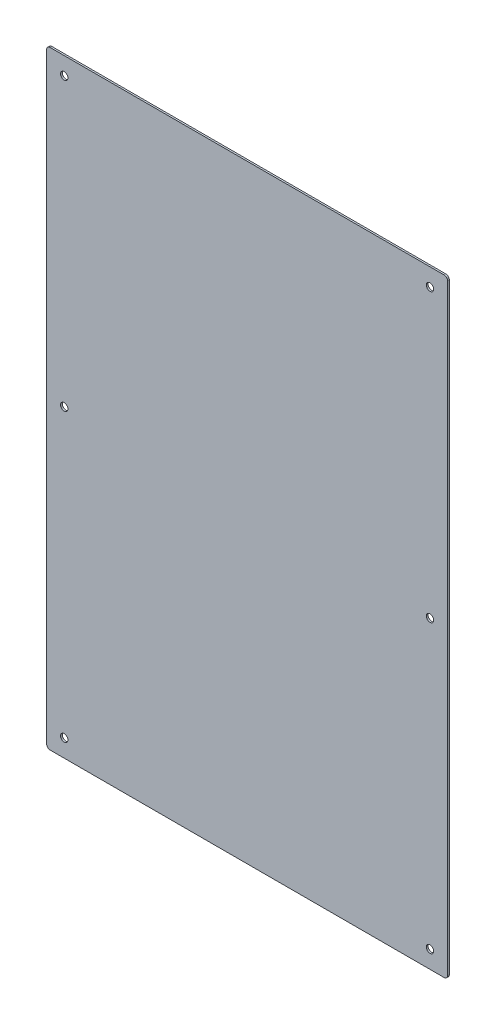
ISO-10303-21;
HEADER;
FILE_DESCRIPTION(('STEP AP214'),'2;1');
FILE_NAME('part.step','',(''),(''),'','','');
FILE_SCHEMA(('AUTOMOTIVE_DESIGN { 1 0 10303 214 1 1 1 1 }'));
ENDSEC;
DATA;
#1=APPLICATION_CONTEXT('core data for automotive mechanical design processes');
#2=APPLICATION_PROTOCOL_DEFINITION('international standard','automotive_design',2000,#1);
#3=PRODUCT_CONTEXT('',#1,'mechanical');
#4=PRODUCT('Part','Part','',(#3));
#5=PRODUCT_RELATED_PRODUCT_CATEGORY('part','',(#4));
#6=PRODUCT_DEFINITION_FORMATION('','',#4);
#7=PRODUCT_DEFINITION_CONTEXT('part definition',#1,'design');
#8=PRODUCT_DEFINITION('design','',#6,#7);
#9=PRODUCT_DEFINITION_SHAPE('','',#8);
#10=(LENGTH_UNIT() NAMED_UNIT(*) SI_UNIT(.MILLI.,.METRE.));
#11=(NAMED_UNIT(*) PLANE_ANGLE_UNIT() SI_UNIT($,.RADIAN.));
#12=(NAMED_UNIT(*) SI_UNIT($,.STERADIAN.) SOLID_ANGLE_UNIT());
#13=UNCERTAINTY_MEASURE_WITH_UNIT(LENGTH_MEASURE(1.E-05),#10,'distance_accuracy_value','');
#14=(GEOMETRIC_REPRESENTATION_CONTEXT(3) GLOBAL_UNCERTAINTY_ASSIGNED_CONTEXT((#13)) GLOBAL_UNIT_ASSIGNED_CONTEXT((#10,
#11,#12)) REPRESENTATION_CONTEXT('',''));
#15=CARTESIAN_POINT('',(0.,0.,0.));
#16=DIRECTION('',(0.,0.,1.));
#17=DIRECTION('',(1.,0.,0.));
#18=AXIS2_PLACEMENT_3D('',#15,#16,#17);
#19=CARTESIAN_POINT('',(-112.,171.,1.));
#20=DIRECTION('',(0.,0.,-1.));
#21=DIRECTION('',(-1.,0.,0.));
#22=AXIS2_PLACEMENT_3D('',#19,#20,#21);
#23=PLANE('',#22);
#24=CARTESIAN_POINT('',(104.,0.,1.));
#25=DIRECTION('',(0.,0.,1.));
#26=DIRECTION('',(-1.,0.,0.));
#27=AXIS2_PLACEMENT_3D('',#24,#25,#26);
#28=CIRCLE('',#27,2.1);
#29=CARTESIAN_POINT('',(101.9,0.,1.));
#30=VERTEX_POINT('',#29);
#31=EDGE_CURVE('E198',#30,#30,#28,.T.);
#32=ORIENTED_EDGE('',*,*,#31,.F.);
#33=EDGE_LOOP('',(#32));
#34=FACE_BOUND('',#33,.T.);
#35=CARTESIAN_POINT('',(-104.,-163.,1.));
#36=DIRECTION('',(0.,0.,1.));
#37=DIRECTION('',(-1.,0.,0.));
#38=AXIS2_PLACEMENT_3D('',#35,#36,#37);
#39=CIRCLE('',#38,2.1);
#40=CARTESIAN_POINT('',(-106.1,-163.,1.));
#41=VERTEX_POINT('',#40);
#42=EDGE_CURVE('E186',#41,#41,#39,.T.);
#43=ORIENTED_EDGE('',*,*,#42,.F.);
#44=EDGE_LOOP('',(#43));
#45=FACE_BOUND('',#44,.T.);
#46=CARTESIAN_POINT('',(-104.,163.,1.));
#47=DIRECTION('',(0.,0.,1.));
#48=DIRECTION('',(1.,0.,0.));
#49=AXIS2_PLACEMENT_3D('',#46,#47,#48);
#50=CIRCLE('',#49,2.1);
#51=CARTESIAN_POINT('',(-101.9,163.,1.));
#52=VERTEX_POINT('',#51);
#53=EDGE_CURVE('E132',#52,#52,#50,.T.);
#54=ORIENTED_EDGE('',*,*,#53,.F.);
#55=EDGE_LOOP('',(#54));
#56=FACE_BOUND('',#55,.T.);
#57=CARTESIAN_POINT('',(-112.,171.,1.));
#58=DIRECTION('',(0.,0.,1.));
#59=DIRECTION('',(-1.,0.,0.));
#60=AXIS2_PLACEMENT_3D('',#57,#58,#59);
#61=CIRCLE('',#60,2.);
#62=CARTESIAN_POINT('',(-112.,173.,1.));
#63=VERTEX_POINT('',#62);
#64=CARTESIAN_POINT('',(-114.,171.,1.));
#65=VERTEX_POINT('',#64);
#66=EDGE_CURVE('E143',#63,#65,#61,.T.);
#67=ORIENTED_EDGE('',*,*,#66,.T.);
#68=DIRECTION('',(0.,-1.,0.));
#69=VECTOR('',#68,1.);
#70=CARTESIAN_POINT('',(-114.,-171.,1.));
#71=LINE('',#70,#69);
#72=CARTESIAN_POINT('',(-114.,-171.,1.));
#73=VERTEX_POINT('',#72);
#74=EDGE_CURVE('E91',#65,#73,#71,.T.);
#75=ORIENTED_EDGE('',*,*,#74,.T.);
#76=CARTESIAN_POINT('',(-112.,-171.,1.));
#77=DIRECTION('',(0.,0.,1.));
#78=DIRECTION('',(-1.,0.,0.));
#79=AXIS2_PLACEMENT_3D('',#76,#77,#78);
#80=CIRCLE('',#79,2.);
#81=CARTESIAN_POINT('',(-112.,-173.,1.));
#82=VERTEX_POINT('',#81);
#83=EDGE_CURVE('E158',#73,#82,#80,.T.);
#84=ORIENTED_EDGE('',*,*,#83,.T.);
#85=DIRECTION('',(1.,0.,0.));
#86=VECTOR('',#85,1.);
#87=CARTESIAN_POINT('',(-112.,-173.,1.));
#88=LINE('',#87,#86);
#89=CARTESIAN_POINT('',(112.,-173.,1.));
#90=VERTEX_POINT('',#89);
#91=EDGE_CURVE('E171',#82,#90,#88,.T.);
#92=ORIENTED_EDGE('',*,*,#91,.T.);
#93=CARTESIAN_POINT('',(112.,-171.,1.));
#94=DIRECTION('',(0.,0.,1.));
#95=DIRECTION('',(1.,0.,0.));
#96=AXIS2_PLACEMENT_3D('',#93,#94,#95);
#97=CIRCLE('',#96,2.);
#98=CARTESIAN_POINT('',(114.,-171.,1.));
#99=VERTEX_POINT('',#98);
#100=EDGE_CURVE('E110',#90,#99,#97,.T.);
#101=ORIENTED_EDGE('',*,*,#100,.T.);
#102=DIRECTION('',(0.,1.,0.));
#103=VECTOR('',#102,1.);
#104=CARTESIAN_POINT('',(114.,-171.,1.));
#105=LINE('',#104,#103);
#106=CARTESIAN_POINT('',(114.,171.,1.));
#107=VERTEX_POINT('',#106);
#108=EDGE_CURVE('E104',#99,#107,#105,.T.);
#109=ORIENTED_EDGE('',*,*,#108,.T.);
#110=CARTESIAN_POINT('',(112.,171.,1.));
#111=DIRECTION('',(0.,0.,1.));
#112=DIRECTION('',(-1.,0.,0.));
#113=AXIS2_PLACEMENT_3D('',#110,#111,#112);
#114=CIRCLE('',#113,2.);
#115=CARTESIAN_POINT('',(112.,173.,1.));
#116=VERTEX_POINT('',#115);
#117=EDGE_CURVE('E108',#107,#116,#114,.T.);
#118=ORIENTED_EDGE('',*,*,#117,.T.);
#119=DIRECTION('',(-1.,0.,0.));
#120=VECTOR('',#119,1.);
#121=CARTESIAN_POINT('',(-112.,173.,1.));
#122=LINE('',#121,#120);
#123=EDGE_CURVE('E48',#116,#63,#122,.T.);
#124=ORIENTED_EDGE('',*,*,#123,.T.);
#125=EDGE_LOOP('',(#67,#75,#84,#92,#101,#109,#118,#124));
#126=FACE_BOUND('',#125,.T.);
#127=CARTESIAN_POINT('',(-104.,0.,1.));
#128=DIRECTION('',(0.,0.,1.));
#129=DIRECTION('',(1.,0.,0.));
#130=AXIS2_PLACEMENT_3D('',#127,#128,#129);
#131=CIRCLE('',#130,2.1);
#132=CARTESIAN_POINT('',(-101.9,0.,1.));
#133=VERTEX_POINT('',#132);
#134=EDGE_CURVE('E180',#133,#133,#131,.T.);
#135=ORIENTED_EDGE('',*,*,#134,.F.);
#136=EDGE_LOOP('',(#135));
#137=FACE_BOUND('',#136,.T.);
#138=CARTESIAN_POINT('',(104.,-163.,1.));
#139=DIRECTION('',(0.,0.,1.));
#140=DIRECTION('',(1.,0.,0.));
#141=AXIS2_PLACEMENT_3D('',#138,#139,#140);
#142=CIRCLE('',#141,2.1);
#143=CARTESIAN_POINT('',(106.1,-163.,1.));
#144=VERTEX_POINT('',#143);
#145=EDGE_CURVE('E192',#144,#144,#142,.T.);
#146=ORIENTED_EDGE('',*,*,#145,.F.);
#147=EDGE_LOOP('',(#146));
#148=FACE_BOUND('',#147,.T.);
#149=CARTESIAN_POINT('',(104.,163.,1.));
#150=DIRECTION('',(0.,0.,1.));
#151=DIRECTION('',(-1.,0.,0.));
#152=AXIS2_PLACEMENT_3D('',#149,#150,#151);
#153=CIRCLE('',#152,2.1);
#154=CARTESIAN_POINT('',(101.9,163.,1.));
#155=VERTEX_POINT('',#154);
#156=EDGE_CURVE('E204',#155,#155,#153,.T.);
#157=ORIENTED_EDGE('',*,*,#156,.F.);
#158=EDGE_LOOP('',(#157));
#159=FACE_BOUND('',#158,.T.);
#160=ADVANCED_FACE('F31',(#34,#45,#56,#126,#137,#148,#159),#23,.F.);
#161=CARTESIAN_POINT('',(-112.,171.,0.));
#162=DIRECTION('',(0.,0.,-1.));
#163=DIRECTION('',(-1.,0.,0.));
#164=AXIS2_PLACEMENT_3D('',#161,#162,#163);
#165=PLANE('',#164);
#166=CARTESIAN_POINT('',(104.,0.,0.));
#167=DIRECTION('',(0.,0.,1.));
#168=DIRECTION('',(-1.,0.,0.));
#169=AXIS2_PLACEMENT_3D('',#166,#167,#168);
#170=CIRCLE('',#169,2.1);
#171=CARTESIAN_POINT('',(101.9,0.,0.));
#172=VERTEX_POINT('',#171);
#173=EDGE_CURVE('E201',#172,#172,#170,.T.);
#174=ORIENTED_EDGE('',*,*,#173,.T.);
#175=EDGE_LOOP('',(#174));
#176=FACE_BOUND('',#175,.T.);
#177=CARTESIAN_POINT('',(-104.,-163.,0.));
#178=DIRECTION('',(0.,0.,1.));
#179=DIRECTION('',(-1.,0.,0.));
#180=AXIS2_PLACEMENT_3D('',#177,#178,#179);
#181=CIRCLE('',#180,2.1);
#182=CARTESIAN_POINT('',(-106.1,-163.,0.));
#183=VERTEX_POINT('',#182);
#184=EDGE_CURVE('E189',#183,#183,#181,.T.);
#185=ORIENTED_EDGE('',*,*,#184,.T.);
#186=EDGE_LOOP('',(#185));
#187=FACE_BOUND('',#186,.T.);
#188=CARTESIAN_POINT('',(-104.,163.,0.));
#189=DIRECTION('',(0.,0.,1.));
#190=DIRECTION('',(1.,0.,0.));
#191=AXIS2_PLACEMENT_3D('',#188,#189,#190);
#192=CIRCLE('',#191,2.1);
#193=CARTESIAN_POINT('',(-101.9,163.,0.));
#194=VERTEX_POINT('',#193);
#195=EDGE_CURVE('E177',#194,#194,#192,.T.);
#196=ORIENTED_EDGE('',*,*,#195,.T.);
#197=EDGE_LOOP('',(#196));
#198=FACE_BOUND('',#197,.T.);
#199=CARTESIAN_POINT('',(-112.,171.,0.));
#200=DIRECTION('',(0.,0.,1.));
#201=DIRECTION('',(-1.,0.,0.));
#202=AXIS2_PLACEMENT_3D('',#199,#200,#201);
#203=CIRCLE('',#202,2.);
#204=CARTESIAN_POINT('',(-112.,173.,0.));
#205=VERTEX_POINT('',#204);
#206=CARTESIAN_POINT('',(-114.,171.,0.));
#207=VERTEX_POINT('',#206);
#208=EDGE_CURVE('E128',#205,#207,#203,.T.);
#209=ORIENTED_EDGE('',*,*,#208,.F.);
#210=DIRECTION('',(-1.,0.,0.));
#211=VECTOR('',#210,1.);
#212=CARTESIAN_POINT('',(-112.,173.,0.));
#213=LINE('',#212,#211);
#214=CARTESIAN_POINT('',(112.,173.,0.));
#215=VERTEX_POINT('',#214);
#216=EDGE_CURVE('E83',#215,#205,#213,.T.);
#217=ORIENTED_EDGE('',*,*,#216,.F.);
#218=CARTESIAN_POINT('',(112.,171.,0.));
#219=DIRECTION('',(0.,0.,1.));
#220=DIRECTION('',(-1.,0.,0.));
#221=AXIS2_PLACEMENT_3D('',#218,#219,#220);
#222=CIRCLE('',#221,2.);
#223=CARTESIAN_POINT('',(114.,171.,0.));
#224=VERTEX_POINT('',#223);
#225=EDGE_CURVE('E77',#224,#215,#222,.T.);
#226=ORIENTED_EDGE('',*,*,#225,.F.);
#227=DIRECTION('',(0.,1.,0.));
#228=VECTOR('',#227,1.);
#229=CARTESIAN_POINT('',(114.,-171.,0.));
#230=LINE('',#229,#228);
#231=CARTESIAN_POINT('',(114.,-171.,0.));
#232=VERTEX_POINT('',#231);
#233=EDGE_CURVE('E118',#232,#224,#230,.T.);
#234=ORIENTED_EDGE('',*,*,#233,.F.);
#235=CARTESIAN_POINT('',(112.,-171.,0.));
#236=DIRECTION('',(0.,0.,1.));
#237=DIRECTION('',(1.,0.,0.));
#238=AXIS2_PLACEMENT_3D('',#235,#236,#237);
#239=CIRCLE('',#238,2.);
#240=CARTESIAN_POINT('',(112.,-173.,0.));
#241=VERTEX_POINT('',#240);
#242=EDGE_CURVE('E138',#241,#232,#239,.T.);
#243=ORIENTED_EDGE('',*,*,#242,.F.);
#244=DIRECTION('',(1.,0.,0.));
#245=VECTOR('',#244,1.);
#246=CARTESIAN_POINT('',(-112.,-173.,0.));
#247=LINE('',#246,#245);
#248=CARTESIAN_POINT('',(-112.,-173.,0.));
#249=VERTEX_POINT('',#248);
#250=EDGE_CURVE('E136',#249,#241,#247,.T.);
#251=ORIENTED_EDGE('',*,*,#250,.F.);
#252=CARTESIAN_POINT('',(-112.,-171.,0.));
#253=DIRECTION('',(0.,0.,1.));
#254=DIRECTION('',(-1.,0.,0.));
#255=AXIS2_PLACEMENT_3D('',#252,#253,#254);
#256=CIRCLE('',#255,2.);
#257=CARTESIAN_POINT('',(-114.,-171.,0.));
#258=VERTEX_POINT('',#257);
#259=EDGE_CURVE('E134',#258,#249,#256,.T.);
#260=ORIENTED_EDGE('',*,*,#259,.F.);
#261=DIRECTION('',(0.,-1.,0.));
#262=VECTOR('',#261,1.);
#263=CARTESIAN_POINT('',(-114.,-171.,0.));
#264=LINE('',#263,#262);
#265=EDGE_CURVE('E131',#207,#258,#264,.T.);
#266=ORIENTED_EDGE('',*,*,#265,.F.);
#267=EDGE_LOOP('',(#209,#217,#226,#234,#243,#251,#260,#266));
#268=FACE_BOUND('',#267,.T.);
#269=CARTESIAN_POINT('',(-104.,0.,0.));
#270=DIRECTION('',(0.,0.,1.));
#271=DIRECTION('',(1.,0.,0.));
#272=AXIS2_PLACEMENT_3D('',#269,#270,#271);
#273=CIRCLE('',#272,2.1);
#274=CARTESIAN_POINT('',(-101.9,0.,0.));
#275=VERTEX_POINT('',#274);
#276=EDGE_CURVE('E183',#275,#275,#273,.T.);
#277=ORIENTED_EDGE('',*,*,#276,.T.);
#278=EDGE_LOOP('',(#277));
#279=FACE_BOUND('',#278,.T.);
#280=CARTESIAN_POINT('',(104.,-163.,0.));
#281=DIRECTION('',(0.,0.,1.));
#282=DIRECTION('',(1.,0.,0.));
#283=AXIS2_PLACEMENT_3D('',#280,#281,#282);
#284=CIRCLE('',#283,2.1);
#285=CARTESIAN_POINT('',(106.1,-163.,0.));
#286=VERTEX_POINT('',#285);
#287=EDGE_CURVE('E195',#286,#286,#284,.T.);
#288=ORIENTED_EDGE('',*,*,#287,.T.);
#289=EDGE_LOOP('',(#288));
#290=FACE_BOUND('',#289,.T.);
#291=CARTESIAN_POINT('',(104.,163.,0.));
#292=DIRECTION('',(0.,0.,1.));
#293=DIRECTION('',(-1.,0.,0.));
#294=AXIS2_PLACEMENT_3D('',#291,#292,#293);
#295=CIRCLE('',#294,2.1);
#296=CARTESIAN_POINT('',(101.9,163.,0.));
#297=VERTEX_POINT('',#296);
#298=EDGE_CURVE('E207',#297,#297,#295,.T.);
#299=ORIENTED_EDGE('',*,*,#298,.T.);
#300=EDGE_LOOP('',(#299));
#301=FACE_BOUND('',#300,.T.);
#302=ADVANCED_FACE('F162',(#176,#187,#198,#268,#279,#290,#301),#165,.T.);
#303=CARTESIAN_POINT('',(-112.,171.,1.));
#304=DIRECTION('',(0.,0.,-1.));
#305=DIRECTION('',(-1.,0.,0.));
#306=AXIS2_PLACEMENT_3D('',#303,#304,#305);
#307=CYLINDRICAL_SURFACE('',#306,2.);
#308=ORIENTED_EDGE('',*,*,#208,.T.);
#309=DIRECTION('',(0.,0.,-1.));
#310=VECTOR('',#309,1.);
#311=CARTESIAN_POINT('',(-114.,171.,1.));
#312=LINE('',#311,#310);
#313=EDGE_CURVE('E11',#65,#207,#312,.T.);
#314=ORIENTED_EDGE('',*,*,#313,.F.);
#315=ORIENTED_EDGE('',*,*,#66,.F.);
#316=DIRECTION('',(0.,0.,-1.));
#317=VECTOR('',#316,1.);
#318=CARTESIAN_POINT('',(-112.,173.,1.));
#319=LINE('',#318,#317);
#320=EDGE_CURVE('E124',#63,#205,#319,.T.);
#321=ORIENTED_EDGE('',*,*,#320,.T.);
#322=EDGE_LOOP('',(#308,#314,#315,#321));
#323=FACE_BOUND('',#322,.T.);
#324=ADVANCED_FACE('F33',(#323),#307,.T.);
#325=CARTESIAN_POINT('',(-114.,-171.,1.));
#326=DIRECTION('',(1.,0.,0.));
#327=DIRECTION('',(0.,0.,-1.));
#328=AXIS2_PLACEMENT_3D('',#325,#326,#327);
#329=PLANE('',#328);
#330=ORIENTED_EDGE('',*,*,#265,.T.);
#331=DIRECTION('',(0.,0.,-1.));
#332=VECTOR('',#331,1.);
#333=CARTESIAN_POINT('',(-114.,-171.,1.));
#334=LINE('',#333,#332);
#335=EDGE_CURVE('E40',#73,#258,#334,.T.);
#336=ORIENTED_EDGE('',*,*,#335,.F.);
#337=ORIENTED_EDGE('',*,*,#74,.F.);
#338=ORIENTED_EDGE('',*,*,#313,.T.);
#339=EDGE_LOOP('',(#330,#336,#337,#338));
#340=FACE_BOUND('',#339,.T.);
#341=ADVANCED_FACE('F242',(#340),#329,.F.);
#342=CARTESIAN_POINT('',(-112.,-171.,1.));
#343=DIRECTION('',(0.,0.,-1.));
#344=DIRECTION('',(-1.,0.,0.));
#345=AXIS2_PLACEMENT_3D('',#342,#343,#344);
#346=CYLINDRICAL_SURFACE('',#345,2.);
#347=ORIENTED_EDGE('',*,*,#259,.T.);
#348=DIRECTION('',(0.,0.,-1.));
#349=VECTOR('',#348,1.);
#350=CARTESIAN_POINT('',(-112.,-173.,1.));
#351=LINE('',#350,#349);
#352=EDGE_CURVE('E150',#82,#249,#351,.T.);
#353=ORIENTED_EDGE('',*,*,#352,.F.);
#354=ORIENTED_EDGE('',*,*,#83,.F.);
#355=ORIENTED_EDGE('',*,*,#335,.T.);
#356=EDGE_LOOP('',(#347,#353,#354,#355));
#357=FACE_BOUND('',#356,.T.);
#358=ADVANCED_FACE('F156',(#357),#346,.T.);
#359=CARTESIAN_POINT('',(-112.,-173.,1.));
#360=DIRECTION('',(0.,1.,0.));
#361=DIRECTION('',(0.,0.,1.));
#362=AXIS2_PLACEMENT_3D('',#359,#360,#361);
#363=PLANE('',#362);
#364=ORIENTED_EDGE('',*,*,#250,.T.);
#365=DIRECTION('',(0.,0.,-1.));
#366=VECTOR('',#365,1.);
#367=CARTESIAN_POINT('',(112.,-173.,1.));
#368=LINE('',#367,#366);
#369=EDGE_CURVE('E147',#90,#241,#368,.T.);
#370=ORIENTED_EDGE('',*,*,#369,.F.);
#371=ORIENTED_EDGE('',*,*,#91,.F.);
#372=ORIENTED_EDGE('',*,*,#352,.T.);
#373=EDGE_LOOP('',(#364,#370,#371,#372));
#374=FACE_BOUND('',#373,.T.);
#375=ADVANCED_FACE('F167',(#374),#363,.F.);
#376=CARTESIAN_POINT('',(112.,-171.,1.));
#377=DIRECTION('',(0.,0.,-1.));
#378=DIRECTION('',(-1.,0.,0.));
#379=AXIS2_PLACEMENT_3D('',#376,#377,#378);
#380=CYLINDRICAL_SURFACE('',#379,2.);
#381=ORIENTED_EDGE('',*,*,#242,.T.);
#382=DIRECTION('',(0.,0.,-1.));
#383=VECTOR('',#382,1.);
#384=CARTESIAN_POINT('',(114.,-171.,1.));
#385=LINE('',#384,#383);
#386=EDGE_CURVE('E119',#99,#232,#385,.T.);
#387=ORIENTED_EDGE('',*,*,#386,.F.);
#388=ORIENTED_EDGE('',*,*,#100,.F.);
#389=ORIENTED_EDGE('',*,*,#369,.T.);
#390=EDGE_LOOP('',(#381,#387,#388,#389));
#391=FACE_BOUND('',#390,.T.);
#392=ADVANCED_FACE('F170',(#391),#380,.T.);
#393=CARTESIAN_POINT('',(114.,-171.,1.));
#394=DIRECTION('',(-1.,0.,0.));
#395=DIRECTION('',(0.,0.,1.));
#396=AXIS2_PLACEMENT_3D('',#393,#394,#395);
#397=PLANE('',#396);
#398=ORIENTED_EDGE('',*,*,#233,.T.);
#399=DIRECTION('',(0.,0.,-1.));
#400=VECTOR('',#399,1.);
#401=CARTESIAN_POINT('',(114.,171.,1.));
#402=LINE('',#401,#400);
#403=EDGE_CURVE('E115',#107,#224,#402,.T.);
#404=ORIENTED_EDGE('',*,*,#403,.F.);
#405=ORIENTED_EDGE('',*,*,#108,.F.);
#406=ORIENTED_EDGE('',*,*,#386,.T.);
#407=EDGE_LOOP('',(#398,#404,#405,#406));
#408=FACE_BOUND('',#407,.T.);
#409=ADVANCED_FACE('F116',(#408),#397,.F.);
#410=CARTESIAN_POINT('',(112.,171.,1.));
#411=DIRECTION('',(0.,0.,-1.));
#412=DIRECTION('',(-1.,0.,0.));
#413=AXIS2_PLACEMENT_3D('',#410,#411,#412);
#414=CYLINDRICAL_SURFACE('',#413,2.);
#415=ORIENTED_EDGE('',*,*,#225,.T.);
#416=DIRECTION('',(0.,0.,-1.));
#417=VECTOR('',#416,1.);
#418=CARTESIAN_POINT('',(112.,173.,1.));
#419=LINE('',#418,#417);
#420=EDGE_CURVE('E120',#116,#215,#419,.T.);
#421=ORIENTED_EDGE('',*,*,#420,.F.);
#422=ORIENTED_EDGE('',*,*,#117,.F.);
#423=ORIENTED_EDGE('',*,*,#403,.T.);
#424=EDGE_LOOP('',(#415,#421,#422,#423));
#425=FACE_BOUND('',#424,.T.);
#426=ADVANCED_FACE('F122',(#425),#414,.T.);
#427=CARTESIAN_POINT('',(-112.,173.,1.));
#428=DIRECTION('',(0.,-1.,0.));
#429=DIRECTION('',(0.,0.,-1.));
#430=AXIS2_PLACEMENT_3D('',#427,#428,#429);
#431=PLANE('',#430);
#432=ORIENTED_EDGE('',*,*,#216,.T.);
#433=ORIENTED_EDGE('',*,*,#320,.F.);
#434=ORIENTED_EDGE('',*,*,#123,.F.);
#435=ORIENTED_EDGE('',*,*,#420,.T.);
#436=EDGE_LOOP('',(#432,#433,#434,#435));
#437=FACE_BOUND('',#436,.T.);
#438=ADVANCED_FACE('F230',(#437),#431,.F.);
#439=CARTESIAN_POINT('',(-104.,163.,1.));
#440=DIRECTION('',(0.,0.,-1.));
#441=DIRECTION('',(-1.,0.,0.));
#442=AXIS2_PLACEMENT_3D('',#439,#440,#441);
#443=CYLINDRICAL_SURFACE('',#442,2.1);
#444=ORIENTED_EDGE('',*,*,#53,.T.);
#445=EDGE_LOOP('',(#444));
#446=FACE_BOUND('',#445,.T.);
#447=ORIENTED_EDGE('',*,*,#195,.F.);
#448=EDGE_LOOP('',(#447));
#449=FACE_BOUND('',#448,.T.);
#450=ADVANCED_FACE('F227',(#446,#449),#443,.F.);
#451=CARTESIAN_POINT('',(-104.,0.,1.));
#452=DIRECTION('',(0.,0.,-1.));
#453=DIRECTION('',(-1.,0.,0.));
#454=AXIS2_PLACEMENT_3D('',#451,#452,#453);
#455=CYLINDRICAL_SURFACE('',#454,2.1);
#456=ORIENTED_EDGE('',*,*,#134,.T.);
#457=EDGE_LOOP('',(#456));
#458=FACE_BOUND('',#457,.T.);
#459=ORIENTED_EDGE('',*,*,#276,.F.);
#460=EDGE_LOOP('',(#459));
#461=FACE_BOUND('',#460,.T.);
#462=ADVANCED_FACE('F306',(#458,#461),#455,.F.);
#463=CARTESIAN_POINT('',(-104.,-163.,1.));
#464=DIRECTION('',(0.,0.,-1.));
#465=DIRECTION('',(-1.,0.,0.));
#466=AXIS2_PLACEMENT_3D('',#463,#464,#465);
#467=CYLINDRICAL_SURFACE('',#466,2.1);
#468=ORIENTED_EDGE('',*,*,#42,.T.);
#469=EDGE_LOOP('',(#468));
#470=FACE_BOUND('',#469,.T.);
#471=ORIENTED_EDGE('',*,*,#184,.F.);
#472=EDGE_LOOP('',(#471));
#473=FACE_BOUND('',#472,.T.);
#474=ADVANCED_FACE('F314',(#470,#473),#467,.F.);
#475=CARTESIAN_POINT('',(104.,-163.,1.));
#476=DIRECTION('',(0.,0.,-1.));
#477=DIRECTION('',(-1.,0.,0.));
#478=AXIS2_PLACEMENT_3D('',#475,#476,#477);
#479=CYLINDRICAL_SURFACE('',#478,2.1);
#480=ORIENTED_EDGE('',*,*,#145,.T.);
#481=EDGE_LOOP('',(#480));
#482=FACE_BOUND('',#481,.T.);
#483=ORIENTED_EDGE('',*,*,#287,.F.);
#484=EDGE_LOOP('',(#483));
#485=FACE_BOUND('',#484,.T.);
#486=ADVANCED_FACE('F322',(#482,#485),#479,.F.);
#487=CARTESIAN_POINT('',(104.,0.,1.));
#488=DIRECTION('',(0.,0.,-1.));
#489=DIRECTION('',(-1.,0.,0.));
#490=AXIS2_PLACEMENT_3D('',#487,#488,#489);
#491=CYLINDRICAL_SURFACE('',#490,2.1);
#492=ORIENTED_EDGE('',*,*,#31,.T.);
#493=EDGE_LOOP('',(#492));
#494=FACE_BOUND('',#493,.T.);
#495=ORIENTED_EDGE('',*,*,#173,.F.);
#496=EDGE_LOOP('',(#495));
#497=FACE_BOUND('',#496,.T.);
#498=ADVANCED_FACE('F331',(#494,#497),#491,.F.);
#499=CARTESIAN_POINT('',(104.,163.,1.));
#500=DIRECTION('',(0.,0.,-1.));
#501=DIRECTION('',(-1.,0.,0.));
#502=AXIS2_PLACEMENT_3D('',#499,#500,#501);
#503=CYLINDRICAL_SURFACE('',#502,2.1);
#504=ORIENTED_EDGE('',*,*,#156,.T.);
#505=EDGE_LOOP('',(#504));
#506=FACE_BOUND('',#505,.T.);
#507=ORIENTED_EDGE('',*,*,#298,.F.);
#508=EDGE_LOOP('',(#507));
#509=FACE_BOUND('',#508,.T.);
#510=ADVANCED_FACE('F213',(#506,#509),#503,.F.);
#511=CLOSED_SHELL('',(#160,#302,#324,#341,#358,#375,#392,#409,#426,#438,#450,#462,#474,#486,
#498,#510));
#512=MANIFOLD_SOLID_BREP('B2',#511);
#513=ADVANCED_BREP_SHAPE_REPRESENTATION('',(#18,#512),#14);
#514=SHAPE_DEFINITION_REPRESENTATION(#9,#513);
ENDSEC;
END-ISO-10303-21;
